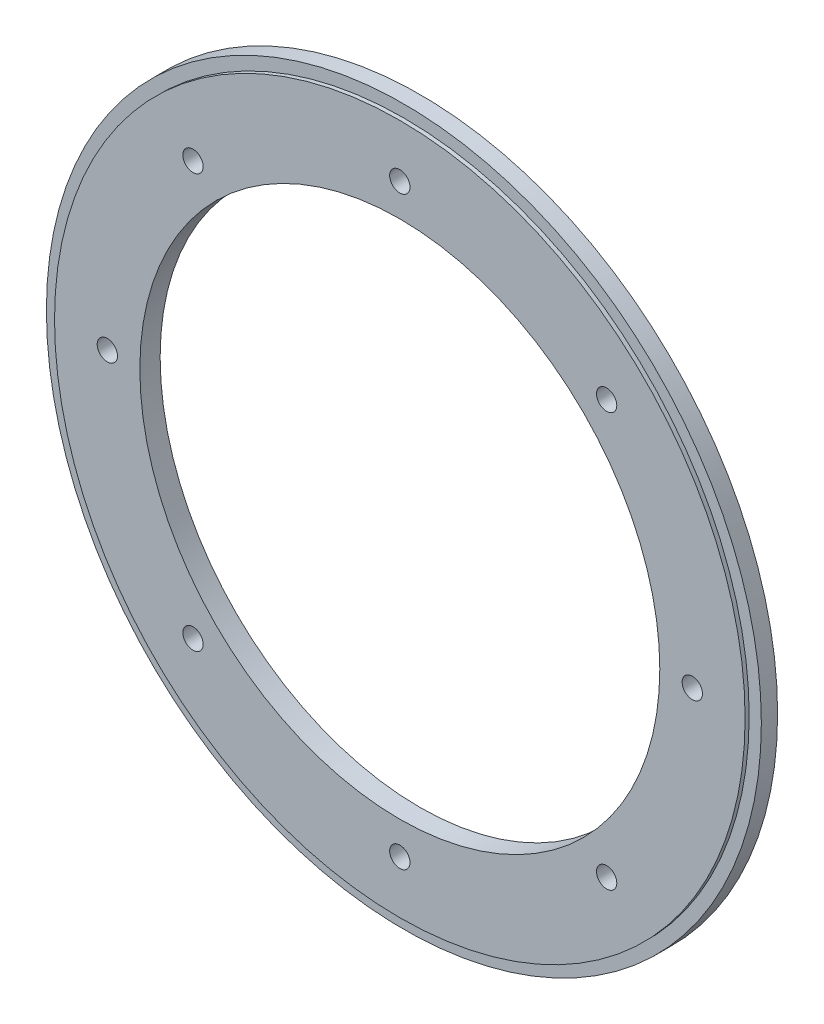
ISO-10303-21;
HEADER;
FILE_DESCRIPTION(('STEP AP214'),'2;1');
FILE_NAME('part.step','',(''),(''),'','','');
FILE_SCHEMA(('AUTOMOTIVE_DESIGN { 1 0 10303 214 1 1 1 1 }'));
ENDSEC;
DATA;
#1=APPLICATION_CONTEXT('core data for automotive mechanical design processes');
#2=APPLICATION_PROTOCOL_DEFINITION('international standard','automotive_design',2000,#1);
#3=PRODUCT_CONTEXT('',#1,'mechanical');
#4=PRODUCT('Part','Part','',(#3));
#5=PRODUCT_RELATED_PRODUCT_CATEGORY('part','',(#4));
#6=PRODUCT_DEFINITION_FORMATION('','',#4);
#7=PRODUCT_DEFINITION_CONTEXT('part definition',#1,'design');
#8=PRODUCT_DEFINITION('design','',#6,#7);
#9=PRODUCT_DEFINITION_SHAPE('','',#8);
#10=(LENGTH_UNIT() NAMED_UNIT(*) SI_UNIT(.MILLI.,.METRE.));
#11=(NAMED_UNIT(*) PLANE_ANGLE_UNIT() SI_UNIT($,.RADIAN.));
#12=(NAMED_UNIT(*) SI_UNIT($,.STERADIAN.) SOLID_ANGLE_UNIT());
#13=UNCERTAINTY_MEASURE_WITH_UNIT(LENGTH_MEASURE(1.E-05),#10,'distance_accuracy_value','');
#14=(GEOMETRIC_REPRESENTATION_CONTEXT(3) GLOBAL_UNCERTAINTY_ASSIGNED_CONTEXT((#13)) GLOBAL_UNIT_ASSIGNED_CONTEXT((#10,
#11,#12)) REPRESENTATION_CONTEXT('',''));
#15=CARTESIAN_POINT('',(0.,0.,0.));
#16=DIRECTION('',(0.,0.,1.));
#17=DIRECTION('',(1.,0.,0.));
#18=AXIS2_PLACEMENT_3D('',#15,#16,#17);
#19=CARTESIAN_POINT('',(0.,42.5,-7.5));
#20=DIRECTION('',(0.,0.,-1.));
#21=DIRECTION('',(-1.,0.,0.));
#22=AXIS2_PLACEMENT_3D('',#19,#20,#21);
#23=PLANE('',#22);
#24=CARTESIAN_POINT('',(36.,0.,-7.5));
#25=DIRECTION('',(0.,0.,1.));
#26=DIRECTION('',(1.,0.,0.));
#27=AXIS2_PLACEMENT_3D('',#24,#25,#26);
#28=CIRCLE('',#27,1.25);
#29=CARTESIAN_POINT('',(37.25,0.,-7.5));
#30=VERTEX_POINT('',#29);
#31=EDGE_CURVE('E125',#30,#30,#28,.T.);
#32=ORIENTED_EDGE('',*,*,#31,.F.);
#33=EDGE_LOOP('',(#32));
#34=FACE_BOUND('',#33,.T.);
#35=CARTESIAN_POINT('',(25.4558441227157,-25.4558441227157,-7.5));
#36=DIRECTION('',(0.,0.,1.));
#37=DIRECTION('',(1.,0.,0.));
#38=AXIS2_PLACEMENT_3D('',#35,#36,#37);
#39=CIRCLE('',#38,1.25);
#40=CARTESIAN_POINT('',(26.7058441227157,-25.4558441227157,-7.5));
#41=VERTEX_POINT('',#40);
#42=EDGE_CURVE('E119',#41,#41,#39,.T.);
#43=ORIENTED_EDGE('',*,*,#42,.F.);
#44=EDGE_LOOP('',(#43));
#45=FACE_BOUND('',#44,.T.);
#46=CARTESIAN_POINT('',(0.,36.,-7.5));
#47=DIRECTION('',(0.,0.,1.));
#48=DIRECTION('',(1.,0.,0.));
#49=AXIS2_PLACEMENT_3D('',#46,#47,#48);
#50=CIRCLE('',#49,1.25);
#51=CARTESIAN_POINT('',(1.25,36.,-7.5));
#52=VERTEX_POINT('',#51);
#53=EDGE_CURVE('E89',#52,#52,#50,.T.);
#54=ORIENTED_EDGE('',*,*,#53,.F.);
#55=EDGE_LOOP('',(#54));
#56=FACE_BOUND('',#55,.T.);
#57=CARTESIAN_POINT('',(25.4558441227157,25.4558441227157,-7.5));
#58=DIRECTION('',(0.,0.,1.));
#59=DIRECTION('',(1.,0.,0.));
#60=AXIS2_PLACEMENT_3D('',#57,#58,#59);
#61=CIRCLE('',#60,1.25);
#62=CARTESIAN_POINT('',(26.7058441227157,25.4558441227157,-7.5));
#63=VERTEX_POINT('',#62);
#64=EDGE_CURVE('E83',#63,#63,#61,.T.);
#65=ORIENTED_EDGE('',*,*,#64,.F.);
#66=EDGE_LOOP('',(#65));
#67=FACE_BOUND('',#66,.T.);
#68=CARTESIAN_POINT('',(0.,0.,-7.5));
#69=DIRECTION('',(0.,0.,1.));
#70=DIRECTION('',(1.,0.,0.));
#71=AXIS2_PLACEMENT_3D('',#68,#69,#70);
#72=CIRCLE('',#71,42.5);
#73=CARTESIAN_POINT('',(42.5,0.,-7.5));
#74=VERTEX_POINT('',#73);
#75=EDGE_CURVE('E72',#74,#74,#72,.T.);
#76=ORIENTED_EDGE('',*,*,#75,.T.);
#77=EDGE_LOOP('',(#76));
#78=FACE_BOUND('',#77,.T.);
#79=CARTESIAN_POINT('',(0.,0.,-7.5));
#80=DIRECTION('',(0.,0.,1.));
#81=DIRECTION('',(1.,0.,0.));
#82=AXIS2_PLACEMENT_3D('',#79,#80,#81);
#83=CIRCLE('',#82,32.);
#84=CARTESIAN_POINT('',(32.,0.,-7.5));
#85=VERTEX_POINT('',#84);
#86=EDGE_CURVE('E77',#85,#85,#83,.T.);
#87=ORIENTED_EDGE('',*,*,#86,.F.);
#88=EDGE_LOOP('',(#87));
#89=FACE_BOUND('',#88,.T.);
#90=CARTESIAN_POINT('',(-25.4558441227157,25.4558441227157,-7.5));
#91=DIRECTION('',(0.,0.,1.));
#92=DIRECTION('',(1.,0.,0.));
#93=AXIS2_PLACEMENT_3D('',#90,#91,#92);
#94=CIRCLE('',#93,1.25);
#95=CARTESIAN_POINT('',(-24.2058441227157,25.4558441227157,-7.5));
#96=VERTEX_POINT('',#95);
#97=EDGE_CURVE('E95',#96,#96,#94,.T.);
#98=ORIENTED_EDGE('',*,*,#97,.F.);
#99=EDGE_LOOP('',(#98));
#100=FACE_BOUND('',#99,.T.);
#101=CARTESIAN_POINT('',(-36.,0.,-7.5));
#102=DIRECTION('',(0.,0.,1.));
#103=DIRECTION('',(1.,0.,0.));
#104=AXIS2_PLACEMENT_3D('',#101,#102,#103);
#105=CIRCLE('',#104,1.25);
#106=CARTESIAN_POINT('',(-34.75,0.,-7.5));
#107=VERTEX_POINT('',#106);
#108=EDGE_CURVE('E101',#107,#107,#105,.T.);
#109=ORIENTED_EDGE('',*,*,#108,.F.);
#110=EDGE_LOOP('',(#109));
#111=FACE_BOUND('',#110,.T.);
#112=CARTESIAN_POINT('',(-25.4558441227157,-25.4558441227157,-7.5));
#113=DIRECTION('',(0.,0.,1.));
#114=DIRECTION('',(1.,0.,0.));
#115=AXIS2_PLACEMENT_3D('',#112,#113,#114);
#116=CIRCLE('',#115,1.25);
#117=CARTESIAN_POINT('',(-24.2058441227157,-25.4558441227157,-7.5));
#118=VERTEX_POINT('',#117);
#119=EDGE_CURVE('E107',#118,#118,#116,.T.);
#120=ORIENTED_EDGE('',*,*,#119,.F.);
#121=EDGE_LOOP('',(#120));
#122=FACE_BOUND('',#121,.T.);
#123=CARTESIAN_POINT('',(0.,-36.,-7.5));
#124=DIRECTION('',(0.,0.,1.));
#125=DIRECTION('',(1.,0.,0.));
#126=AXIS2_PLACEMENT_3D('',#123,#124,#125);
#127=CIRCLE('',#126,1.25);
#128=CARTESIAN_POINT('',(1.25000000000002,-36.,-7.5));
#129=VERTEX_POINT('',#128);
#130=EDGE_CURVE('E113',#129,#129,#127,.T.);
#131=ORIENTED_EDGE('',*,*,#130,.F.);
#132=EDGE_LOOP('',(#131));
#133=FACE_BOUND('',#132,.T.);
#134=ADVANCED_FACE('F57',(#34,#45,#56,#67,#78,#89,#100,#111,#122,#133),#23,.F.);
#135=CARTESIAN_POINT('',(0.,32.,-10.));
#136=DIRECTION('',(0.,0.,1.));
#137=DIRECTION('',(1.,0.,0.));
#138=AXIS2_PLACEMENT_3D('',#135,#136,#137);
#139=PLANE('',#138);
#140=CARTESIAN_POINT('',(36.,0.,-10.));
#141=DIRECTION('',(0.,0.,1.));
#142=DIRECTION('',(1.,0.,0.));
#143=AXIS2_PLACEMENT_3D('',#140,#141,#142);
#144=CIRCLE('',#143,1.25);
#145=CARTESIAN_POINT('',(37.25,0.,-10.));
#146=VERTEX_POINT('',#145);
#147=EDGE_CURVE('E128',#146,#146,#144,.T.);
#148=ORIENTED_EDGE('',*,*,#147,.T.);
#149=EDGE_LOOP('',(#148));
#150=FACE_BOUND('',#149,.T.);
#151=CARTESIAN_POINT('',(25.4558441227157,-25.4558441227157,-10.));
#152=DIRECTION('',(0.,0.,1.));
#153=DIRECTION('',(1.,0.,0.));
#154=AXIS2_PLACEMENT_3D('',#151,#152,#153);
#155=CIRCLE('',#154,1.25);
#156=CARTESIAN_POINT('',(26.7058441227157,-25.4558441227157,-10.));
#157=VERTEX_POINT('',#156);
#158=EDGE_CURVE('E122',#157,#157,#155,.T.);
#159=ORIENTED_EDGE('',*,*,#158,.T.);
#160=EDGE_LOOP('',(#159));
#161=FACE_BOUND('',#160,.T.);
#162=CARTESIAN_POINT('',(0.,-36.,-10.));
#163=DIRECTION('',(0.,0.,1.));
#164=DIRECTION('',(1.,0.,0.));
#165=AXIS2_PLACEMENT_3D('',#162,#163,#164);
#166=CIRCLE('',#165,1.25);
#167=CARTESIAN_POINT('',(1.25000000000002,-36.,-10.));
#168=VERTEX_POINT('',#167);
#169=EDGE_CURVE('E116',#168,#168,#166,.T.);
#170=ORIENTED_EDGE('',*,*,#169,.T.);
#171=EDGE_LOOP('',(#170));
#172=FACE_BOUND('',#171,.T.);
#173=CARTESIAN_POINT('',(-25.4558441227157,-25.4558441227157,-10.));
#174=DIRECTION('',(0.,0.,1.));
#175=DIRECTION('',(1.,0.,0.));
#176=AXIS2_PLACEMENT_3D('',#173,#174,#175);
#177=CIRCLE('',#176,1.25);
#178=CARTESIAN_POINT('',(-24.2058441227157,-25.4558441227157,-10.));
#179=VERTEX_POINT('',#178);
#180=EDGE_CURVE('E110',#179,#179,#177,.T.);
#181=ORIENTED_EDGE('',*,*,#180,.T.);
#182=EDGE_LOOP('',(#181));
#183=FACE_BOUND('',#182,.T.);
#184=CARTESIAN_POINT('',(-36.,0.,-10.));
#185=DIRECTION('',(0.,0.,1.));
#186=DIRECTION('',(1.,0.,0.));
#187=AXIS2_PLACEMENT_3D('',#184,#185,#186);
#188=CIRCLE('',#187,1.25);
#189=CARTESIAN_POINT('',(-34.75,0.,-10.));
#190=VERTEX_POINT('',#189);
#191=EDGE_CURVE('E104',#190,#190,#188,.T.);
#192=ORIENTED_EDGE('',*,*,#191,.T.);
#193=EDGE_LOOP('',(#192));
#194=FACE_BOUND('',#193,.T.);
#195=CARTESIAN_POINT('',(-25.4558441227157,25.4558441227157,-10.));
#196=DIRECTION('',(0.,0.,1.));
#197=DIRECTION('',(1.,0.,0.));
#198=AXIS2_PLACEMENT_3D('',#195,#196,#197);
#199=CIRCLE('',#198,1.25);
#200=CARTESIAN_POINT('',(-24.2058441227157,25.4558441227157,-10.));
#201=VERTEX_POINT('',#200);
#202=EDGE_CURVE('E98',#201,#201,#199,.T.);
#203=ORIENTED_EDGE('',*,*,#202,.T.);
#204=EDGE_LOOP('',(#203));
#205=FACE_BOUND('',#204,.T.);
#206=CARTESIAN_POINT('',(0.,36.,-10.));
#207=DIRECTION('',(0.,0.,1.));
#208=DIRECTION('',(1.,0.,0.));
#209=AXIS2_PLACEMENT_3D('',#206,#207,#208);
#210=CIRCLE('',#209,1.25);
#211=CARTESIAN_POINT('',(1.25,36.,-10.));
#212=VERTEX_POINT('',#211);
#213=EDGE_CURVE('E92',#212,#212,#210,.T.);
#214=ORIENTED_EDGE('',*,*,#213,.T.);
#215=EDGE_LOOP('',(#214));
#216=FACE_BOUND('',#215,.T.);
#217=CARTESIAN_POINT('',(25.4558441227157,25.4558441227157,-10.));
#218=DIRECTION('',(0.,0.,1.));
#219=DIRECTION('',(1.,0.,0.));
#220=AXIS2_PLACEMENT_3D('',#217,#218,#219);
#221=CIRCLE('',#220,1.25);
#222=CARTESIAN_POINT('',(26.7058441227157,25.4558441227157,-10.));
#223=VERTEX_POINT('',#222);
#224=EDGE_CURVE('E86',#223,#223,#221,.T.);
#225=ORIENTED_EDGE('',*,*,#224,.T.);
#226=EDGE_LOOP('',(#225));
#227=FACE_BOUND('',#226,.T.);
#228=CARTESIAN_POINT('',(0.,0.,-10.));
#229=DIRECTION('',(0.,0.,1.));
#230=DIRECTION('',(1.,0.,0.));
#231=AXIS2_PLACEMENT_3D('',#228,#229,#230);
#232=CIRCLE('',#231,44.);
#233=CARTESIAN_POINT('',(44.,0.,-10.));
#234=VERTEX_POINT('',#233);
#235=EDGE_CURVE('E11',#234,#234,#232,.T.);
#236=ORIENTED_EDGE('',*,*,#235,.F.);
#237=EDGE_LOOP('',(#236));
#238=FACE_BOUND('',#237,.T.);
#239=CARTESIAN_POINT('',(0.,0.,-10.));
#240=DIRECTION('',(0.,0.,1.));
#241=DIRECTION('',(1.,0.,0.));
#242=AXIS2_PLACEMENT_3D('',#239,#240,#241);
#243=CIRCLE('',#242,32.);
#244=CARTESIAN_POINT('',(32.,0.,-10.));
#245=VERTEX_POINT('',#244);
#246=EDGE_CURVE('E80',#245,#245,#243,.T.);
#247=ORIENTED_EDGE('',*,*,#246,.T.);
#248=EDGE_LOOP('',(#247));
#249=FACE_BOUND('',#248,.T.);
#250=ADVANCED_FACE('F59',(#150,#161,#172,#183,#194,#205,#216,#227,#238,#249),#139,.F.);
#251=CARTESIAN_POINT('',(0.,0.,0.));
#252=DIRECTION('',(0.,0.,1.));
#253=DIRECTION('',(1.,0.,0.));
#254=AXIS2_PLACEMENT_3D('',#251,#252,#253);
#255=CYLINDRICAL_SURFACE('',#254,44.);
#256=CARTESIAN_POINT('',(0.,0.,-8.));
#257=DIRECTION('',(0.,0.,1.));
#258=DIRECTION('',(1.,0.,0.));
#259=AXIS2_PLACEMENT_3D('',#256,#257,#258);
#260=CIRCLE('',#259,44.);
#261=CARTESIAN_POINT('',(44.,0.,-8.));
#262=VERTEX_POINT('',#261);
#263=EDGE_CURVE('E64',#262,#262,#260,.T.);
#264=ORIENTED_EDGE('',*,*,#263,.F.);
#265=EDGE_LOOP('',(#264));
#266=FACE_BOUND('',#265,.T.);
#267=ORIENTED_EDGE('',*,*,#235,.T.);
#268=EDGE_LOOP('',(#267));
#269=FACE_BOUND('',#268,.T.);
#270=ADVANCED_FACE('F203',(#266,#269),#255,.T.);
#271=CARTESIAN_POINT('',(0.,42.5,-8.));
#272=DIRECTION('',(0.,0.,-1.));
#273=DIRECTION('',(-1.,0.,0.));
#274=AXIS2_PLACEMENT_3D('',#271,#272,#273);
#275=PLANE('',#274);
#276=CARTESIAN_POINT('',(0.,0.,-8.));
#277=DIRECTION('',(0.,0.,1.));
#278=DIRECTION('',(1.,0.,0.));
#279=AXIS2_PLACEMENT_3D('',#276,#277,#278);
#280=CIRCLE('',#279,42.5);
#281=CARTESIAN_POINT('',(42.5,0.,-8.));
#282=VERTEX_POINT('',#281);
#283=EDGE_CURVE('E68',#282,#282,#280,.T.);
#284=ORIENTED_EDGE('',*,*,#283,.F.);
#285=EDGE_LOOP('',(#284));
#286=FACE_BOUND('',#285,.T.);
#287=ORIENTED_EDGE('',*,*,#263,.T.);
#288=EDGE_LOOP('',(#287));
#289=FACE_BOUND('',#288,.T.);
#290=ADVANCED_FACE('F200',(#286,#289),#275,.F.);
#291=CARTESIAN_POINT('',(0.,0.,0.));
#292=DIRECTION('',(0.,0.,1.));
#293=DIRECTION('',(1.,0.,0.));
#294=AXIS2_PLACEMENT_3D('',#291,#292,#293);
#295=CYLINDRICAL_SURFACE('',#294,42.5);
#296=ORIENTED_EDGE('',*,*,#75,.F.);
#297=EDGE_LOOP('',(#296));
#298=FACE_BOUND('',#297,.T.);
#299=ORIENTED_EDGE('',*,*,#283,.T.);
#300=EDGE_LOOP('',(#299));
#301=FACE_BOUND('',#300,.T.);
#302=ADVANCED_FACE('F195',(#298,#301),#295,.T.);
#303=CARTESIAN_POINT('',(0.,0.,0.));
#304=DIRECTION('',(0.,0.,1.));
#305=DIRECTION('',(1.,0.,0.));
#306=AXIS2_PLACEMENT_3D('',#303,#304,#305);
#307=CYLINDRICAL_SURFACE('',#306,32.);
#308=ORIENTED_EDGE('',*,*,#246,.F.);
#309=EDGE_LOOP('',(#308));
#310=FACE_BOUND('',#309,.T.);
#311=ORIENTED_EDGE('',*,*,#86,.T.);
#312=EDGE_LOOP('',(#311));
#313=FACE_BOUND('',#312,.T.);
#314=ADVANCED_FACE('F192',(#310,#313),#307,.F.);
#315=CARTESIAN_POINT('',(25.4558441227157,25.4558441227157,0.));
#316=DIRECTION('',(0.,0.,1.));
#317=DIRECTION('',(1.,0.,0.));
#318=AXIS2_PLACEMENT_3D('',#315,#316,#317);
#319=CYLINDRICAL_SURFACE('',#318,1.25);
#320=ORIENTED_EDGE('',*,*,#224,.F.);
#321=EDGE_LOOP('',(#320));
#322=FACE_BOUND('',#321,.T.);
#323=ORIENTED_EDGE('',*,*,#64,.T.);
#324=EDGE_LOOP('',(#323));
#325=FACE_BOUND('',#324,.T.);
#326=ADVANCED_FACE('F188',(#322,#325),#319,.F.);
#327=CARTESIAN_POINT('',(0.,36.,0.));
#328=DIRECTION('',(0.,0.,1.));
#329=DIRECTION('',(1.,0.,0.));
#330=AXIS2_PLACEMENT_3D('',#327,#328,#329);
#331=CYLINDRICAL_SURFACE('',#330,1.25);
#332=ORIENTED_EDGE('',*,*,#213,.F.);
#333=EDGE_LOOP('',(#332));
#334=FACE_BOUND('',#333,.T.);
#335=ORIENTED_EDGE('',*,*,#53,.T.);
#336=EDGE_LOOP('',(#335));
#337=FACE_BOUND('',#336,.T.);
#338=ADVANCED_FACE('F184',(#334,#337),#331,.F.);
#339=CARTESIAN_POINT('',(-25.4558441227157,25.4558441227157,0.));
#340=DIRECTION('',(0.,0.,1.));
#341=DIRECTION('',(1.,0.,0.));
#342=AXIS2_PLACEMENT_3D('',#339,#340,#341);
#343=CYLINDRICAL_SURFACE('',#342,1.25);
#344=ORIENTED_EDGE('',*,*,#202,.F.);
#345=EDGE_LOOP('',(#344));
#346=FACE_BOUND('',#345,.T.);
#347=ORIENTED_EDGE('',*,*,#97,.T.);
#348=EDGE_LOOP('',(#347));
#349=FACE_BOUND('',#348,.T.);
#350=ADVANCED_FACE('F180',(#346,#349),#343,.F.);
#351=CARTESIAN_POINT('',(-36.,0.,0.));
#352=DIRECTION('',(0.,0.,1.));
#353=DIRECTION('',(1.,0.,0.));
#354=AXIS2_PLACEMENT_3D('',#351,#352,#353);
#355=CYLINDRICAL_SURFACE('',#354,1.25);
#356=ORIENTED_EDGE('',*,*,#191,.F.);
#357=EDGE_LOOP('',(#356));
#358=FACE_BOUND('',#357,.T.);
#359=ORIENTED_EDGE('',*,*,#108,.T.);
#360=EDGE_LOOP('',(#359));
#361=FACE_BOUND('',#360,.T.);
#362=ADVANCED_FACE('F173',(#358,#361),#355,.F.);
#363=CARTESIAN_POINT('',(-25.4558441227157,-25.4558441227157,0.));
#364=DIRECTION('',(0.,0.,1.));
#365=DIRECTION('',(1.,0.,0.));
#366=AXIS2_PLACEMENT_3D('',#363,#364,#365);
#367=CYLINDRICAL_SURFACE('',#366,1.25);
#368=ORIENTED_EDGE('',*,*,#180,.F.);
#369=EDGE_LOOP('',(#368));
#370=FACE_BOUND('',#369,.T.);
#371=ORIENTED_EDGE('',*,*,#119,.T.);
#372=EDGE_LOOP('',(#371));
#373=FACE_BOUND('',#372,.T.);
#374=ADVANCED_FACE('F164',(#370,#373),#367,.F.);
#375=CARTESIAN_POINT('',(0.,-36.,0.));
#376=DIRECTION('',(0.,0.,1.));
#377=DIRECTION('',(1.,0.,0.));
#378=AXIS2_PLACEMENT_3D('',#375,#376,#377);
#379=CYLINDRICAL_SURFACE('',#378,1.25);
#380=ORIENTED_EDGE('',*,*,#169,.F.);
#381=EDGE_LOOP('',(#380));
#382=FACE_BOUND('',#381,.T.);
#383=ORIENTED_EDGE('',*,*,#130,.T.);
#384=EDGE_LOOP('',(#383));
#385=FACE_BOUND('',#384,.T.);
#386=ADVANCED_FACE('F162',(#382,#385),#379,.F.);
#387=CARTESIAN_POINT('',(25.4558441227157,-25.4558441227157,0.));
#388=DIRECTION('',(0.,0.,1.));
#389=DIRECTION('',(1.,0.,0.));
#390=AXIS2_PLACEMENT_3D('',#387,#388,#389);
#391=CYLINDRICAL_SURFACE('',#390,1.25);
#392=ORIENTED_EDGE('',*,*,#158,.F.);
#393=EDGE_LOOP('',(#392));
#394=FACE_BOUND('',#393,.T.);
#395=ORIENTED_EDGE('',*,*,#42,.T.);
#396=EDGE_LOOP('',(#395));
#397=FACE_BOUND('',#396,.T.);
#398=ADVANCED_FACE('F137',(#394,#397),#391,.F.);
#399=CARTESIAN_POINT('',(36.,0.,0.));
#400=DIRECTION('',(0.,0.,1.));
#401=DIRECTION('',(1.,0.,0.));
#402=AXIS2_PLACEMENT_3D('',#399,#400,#401);
#403=CYLINDRICAL_SURFACE('',#402,1.25);
#404=ORIENTED_EDGE('',*,*,#147,.F.);
#405=EDGE_LOOP('',(#404));
#406=FACE_BOUND('',#405,.T.);
#407=ORIENTED_EDGE('',*,*,#31,.T.);
#408=EDGE_LOOP('',(#407));
#409=FACE_BOUND('',#408,.T.);
#410=ADVANCED_FACE('F134',(#406,#409),#403,.F.);
#411=CLOSED_SHELL('',(#134,#250,#270,#290,#302,#314,#326,#338,#350,#362,#374,#386,#398,#410));
#412=MANIFOLD_SOLID_BREP('B2',#411);
#413=ADVANCED_BREP_SHAPE_REPRESENTATION('',(#18,#412),#14);
#414=SHAPE_DEFINITION_REPRESENTATION(#9,#413);
ENDSEC;
END-ISO-10303-21;
